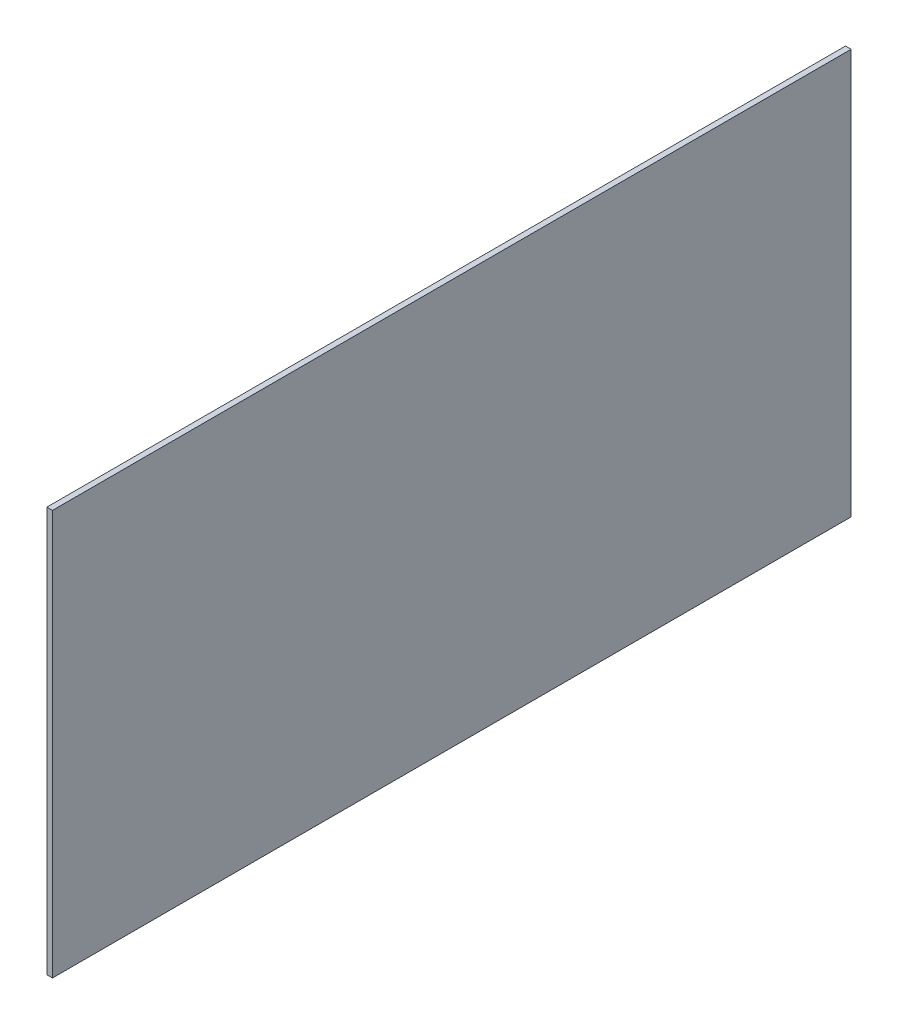
ISO-10303-21;
HEADER;
FILE_DESCRIPTION(('STEP AP214'),'2;1');
FILE_NAME('part.step','',(''),(''),'','','');
FILE_SCHEMA(('AUTOMOTIVE_DESIGN { 1 0 10303 214 1 1 1 1 }'));
ENDSEC;
DATA;
#1=APPLICATION_CONTEXT('core data for automotive mechanical design processes');
#2=APPLICATION_PROTOCOL_DEFINITION('international standard','automotive_design',2000,#1);
#3=PRODUCT_CONTEXT('',#1,'mechanical');
#4=PRODUCT('Part','Part','',(#3));
#5=PRODUCT_RELATED_PRODUCT_CATEGORY('part','',(#4));
#6=PRODUCT_DEFINITION_FORMATION('','',#4);
#7=PRODUCT_DEFINITION_CONTEXT('part definition',#1,'design');
#8=PRODUCT_DEFINITION('design','',#6,#7);
#9=PRODUCT_DEFINITION_SHAPE('','',#8);
#10=(LENGTH_UNIT() NAMED_UNIT(*) SI_UNIT(.MILLI.,.METRE.));
#11=(NAMED_UNIT(*) PLANE_ANGLE_UNIT() SI_UNIT($,.RADIAN.));
#12=(NAMED_UNIT(*) SI_UNIT($,.STERADIAN.) SOLID_ANGLE_UNIT());
#13=UNCERTAINTY_MEASURE_WITH_UNIT(LENGTH_MEASURE(1.E-05),#10,'distance_accuracy_value','');
#14=(GEOMETRIC_REPRESENTATION_CONTEXT(3) GLOBAL_UNCERTAINTY_ASSIGNED_CONTEXT((#13)) GLOBAL_UNIT_ASSIGNED_CONTEXT((#10,
#11,#12)) REPRESENTATION_CONTEXT('',''));
#15=CARTESIAN_POINT('',(0.,0.,0.));
#16=DIRECTION('',(0.,0.,1.));
#17=DIRECTION('',(1.,0.,0.));
#18=AXIS2_PLACEMENT_3D('',#15,#16,#17);
#19=CARTESIAN_POINT('',(-126.,-60.,150.));
#20=DIRECTION('',(0.,-1.,0.));
#21=DIRECTION('',(0.,0.,-1.));
#22=AXIS2_PLACEMENT_3D('',#19,#20,#21);
#23=PLANE('',#22);
#24=DIRECTION('',(1.,0.,0.));
#25=VECTOR('',#24,1.);
#26=CARTESIAN_POINT('',(-135.,-60.,-71.));
#27=LINE('',#26,#25);
#28=CARTESIAN_POINT('',(-126.,-60.,-71.));
#29=VERTEX_POINT('',#28);
#30=CARTESIAN_POINT('',(-125.,-60.,-71.));
#31=VERTEX_POINT('',#30);
#32=EDGE_CURVE('E61',#29,#31,#27,.T.);
#33=ORIENTED_EDGE('',*,*,#32,.T.);
#34=DIRECTION('',(0.,0.,-1.));
#35=VECTOR('',#34,1.);
#36=CARTESIAN_POINT('',(-125.,-60.,150.));
#37=LINE('',#36,#35);
#38=CARTESIAN_POINT('',(-125.,-60.,71.));
#39=VERTEX_POINT('',#38);
#40=EDGE_CURVE('E42',#39,#31,#37,.T.);
#41=ORIENTED_EDGE('',*,*,#40,.F.);
#42=DIRECTION('',(1.,0.,0.));
#43=VECTOR('',#42,1.);
#44=CARTESIAN_POINT('',(-135.,-60.,71.));
#45=LINE('',#44,#43);
#46=CARTESIAN_POINT('',(-126.,-60.,71.));
#47=VERTEX_POINT('',#46);
#48=EDGE_CURVE('E53',#47,#39,#45,.T.);
#49=ORIENTED_EDGE('',*,*,#48,.F.);
#50=DIRECTION('',(0.,0.,-1.));
#51=VECTOR('',#50,1.);
#52=CARTESIAN_POINT('',(-126.,-60.,150.));
#53=LINE('',#52,#51);
#54=EDGE_CURVE('E11',#47,#29,#53,.T.);
#55=ORIENTED_EDGE('',*,*,#54,.T.);
#56=EDGE_LOOP('',(#33,#41,#49,#55));
#57=FACE_BOUND('',#56,.T.);
#58=ADVANCED_FACE('F39',(#57),#23,.T.);
#59=CARTESIAN_POINT('',(-126.,0.,0.));
#60=DIRECTION('',(-1.,0.,0.));
#61=DIRECTION('',(0.,0.,1.));
#62=AXIS2_PLACEMENT_3D('',#59,#60,#61);
#63=PLANE('',#62);
#64=DIRECTION('',(0.,1.,0.));
#65=VECTOR('',#64,1.);
#66=CARTESIAN_POINT('',(-126.,0.,-71.));
#67=LINE('',#66,#65);
#68=CARTESIAN_POINT('',(-126.,12.,-71.));
#69=VERTEX_POINT('',#68);
#70=EDGE_CURVE('E108',#29,#69,#67,.T.);
#71=ORIENTED_EDGE('',*,*,#70,.F.);
#72=ORIENTED_EDGE('',*,*,#54,.F.);
#73=DIRECTION('',(0.,-1.,0.));
#74=VECTOR('',#73,1.);
#75=CARTESIAN_POINT('',(-126.,0.,71.));
#76=LINE('',#75,#74);
#77=CARTESIAN_POINT('',(-126.,12.,71.));
#78=VERTEX_POINT('',#77);
#79=EDGE_CURVE('E103',#78,#47,#76,.T.);
#80=ORIENTED_EDGE('',*,*,#79,.F.);
#81=DIRECTION('',(0.,0.,1.));
#82=VECTOR('',#81,1.);
#83=CARTESIAN_POINT('',(-126.,12.,0.));
#84=LINE('',#83,#82);
#85=EDGE_CURVE('E87',#69,#78,#84,.T.);
#86=ORIENTED_EDGE('',*,*,#85,.F.);
#87=EDGE_LOOP('',(#71,#72,#80,#86));
#88=FACE_BOUND('',#87,.T.);
#89=ADVANCED_FACE('F112',(#88),#63,.T.);
#90=CARTESIAN_POINT('',(-125.,0.,0.));
#91=DIRECTION('',(-1.,0.,0.));
#92=DIRECTION('',(0.,0.,1.));
#93=AXIS2_PLACEMENT_3D('',#90,#91,#92);
#94=PLANE('',#93);
#95=ORIENTED_EDGE('',*,*,#40,.T.);
#96=DIRECTION('',(0.,-1.,0.));
#97=VECTOR('',#96,1.);
#98=CARTESIAN_POINT('',(-125.,12.,-71.));
#99=LINE('',#98,#97);
#100=CARTESIAN_POINT('',(-125.,12.,-71.));
#101=VERTEX_POINT('',#100);
#102=EDGE_CURVE('E98',#101,#31,#99,.T.);
#103=ORIENTED_EDGE('',*,*,#102,.F.);
#104=DIRECTION('',(0.,0.,-1.));
#105=VECTOR('',#104,1.);
#106=CARTESIAN_POINT('',(-125.,12.,71.));
#107=LINE('',#106,#105);
#108=CARTESIAN_POINT('',(-125.,12.,71.));
#109=VERTEX_POINT('',#108);
#110=EDGE_CURVE('E84',#109,#101,#107,.T.);
#111=ORIENTED_EDGE('',*,*,#110,.F.);
#112=DIRECTION('',(0.,1.,0.));
#113=VECTOR('',#112,1.);
#114=CARTESIAN_POINT('',(-125.,-60.,71.));
#115=LINE('',#114,#113);
#116=EDGE_CURVE('E91',#39,#109,#115,.T.);
#117=ORIENTED_EDGE('',*,*,#116,.F.);
#118=EDGE_LOOP('',(#95,#103,#111,#117));
#119=FACE_BOUND('',#118,.T.);
#120=ADVANCED_FACE('F97',(#119),#94,.F.);
#121=CARTESIAN_POINT('',(-135.,12.,-71.));
#122=DIRECTION('',(0.,0.,1.));
#123=DIRECTION('',(1.,0.,0.));
#124=AXIS2_PLACEMENT_3D('',#121,#122,#123);
#125=PLANE('',#124);
#126=ORIENTED_EDGE('',*,*,#70,.T.);
#127=DIRECTION('',(1.,0.,0.));
#128=VECTOR('',#127,1.);
#129=CARTESIAN_POINT('',(-135.,12.,-71.));
#130=LINE('',#129,#128);
#131=EDGE_CURVE('E89',#69,#101,#130,.T.);
#132=ORIENTED_EDGE('',*,*,#131,.T.);
#133=ORIENTED_EDGE('',*,*,#102,.T.);
#134=ORIENTED_EDGE('',*,*,#32,.F.);
#135=EDGE_LOOP('',(#126,#132,#133,#134));
#136=FACE_BOUND('',#135,.T.);
#137=ADVANCED_FACE('F119',(#136),#125,.F.);
#138=CARTESIAN_POINT('',(-135.,12.,71.));
#139=DIRECTION('',(0.,-1.,0.));
#140=DIRECTION('',(0.,0.,-1.));
#141=AXIS2_PLACEMENT_3D('',#138,#139,#140);
#142=PLANE('',#141);
#143=ORIENTED_EDGE('',*,*,#85,.T.);
#144=DIRECTION('',(1.,0.,0.));
#145=VECTOR('',#144,1.);
#146=CARTESIAN_POINT('',(-135.,12.,71.));
#147=LINE('',#146,#145);
#148=EDGE_CURVE('E80',#78,#109,#147,.T.);
#149=ORIENTED_EDGE('',*,*,#148,.T.);
#150=ORIENTED_EDGE('',*,*,#110,.T.);
#151=ORIENTED_EDGE('',*,*,#131,.F.);
#152=EDGE_LOOP('',(#143,#149,#150,#151));
#153=FACE_BOUND('',#152,.T.);
#154=ADVANCED_FACE('F81',(#153),#142,.F.);
#155=CARTESIAN_POINT('',(-135.,-60.,71.));
#156=DIRECTION('',(0.,0.,-1.));
#157=DIRECTION('',(-1.,0.,0.));
#158=AXIS2_PLACEMENT_3D('',#155,#156,#157);
#159=PLANE('',#158);
#160=ORIENTED_EDGE('',*,*,#79,.T.);
#161=ORIENTED_EDGE('',*,*,#48,.T.);
#162=ORIENTED_EDGE('',*,*,#116,.T.);
#163=ORIENTED_EDGE('',*,*,#148,.F.);
#164=EDGE_LOOP('',(#160,#161,#162,#163));
#165=FACE_BOUND('',#164,.T.);
#166=ADVANCED_FACE('F92',(#165),#159,.F.);
#167=CLOSED_SHELL('',(#58,#89,#120,#137,#154,#166));
#168=MANIFOLD_SOLID_BREP('B2',#167);
#169=ADVANCED_BREP_SHAPE_REPRESENTATION('',(#18,#168),#14);
#170=SHAPE_DEFINITION_REPRESENTATION(#9,#169);
ENDSEC;
END-ISO-10303-21;
